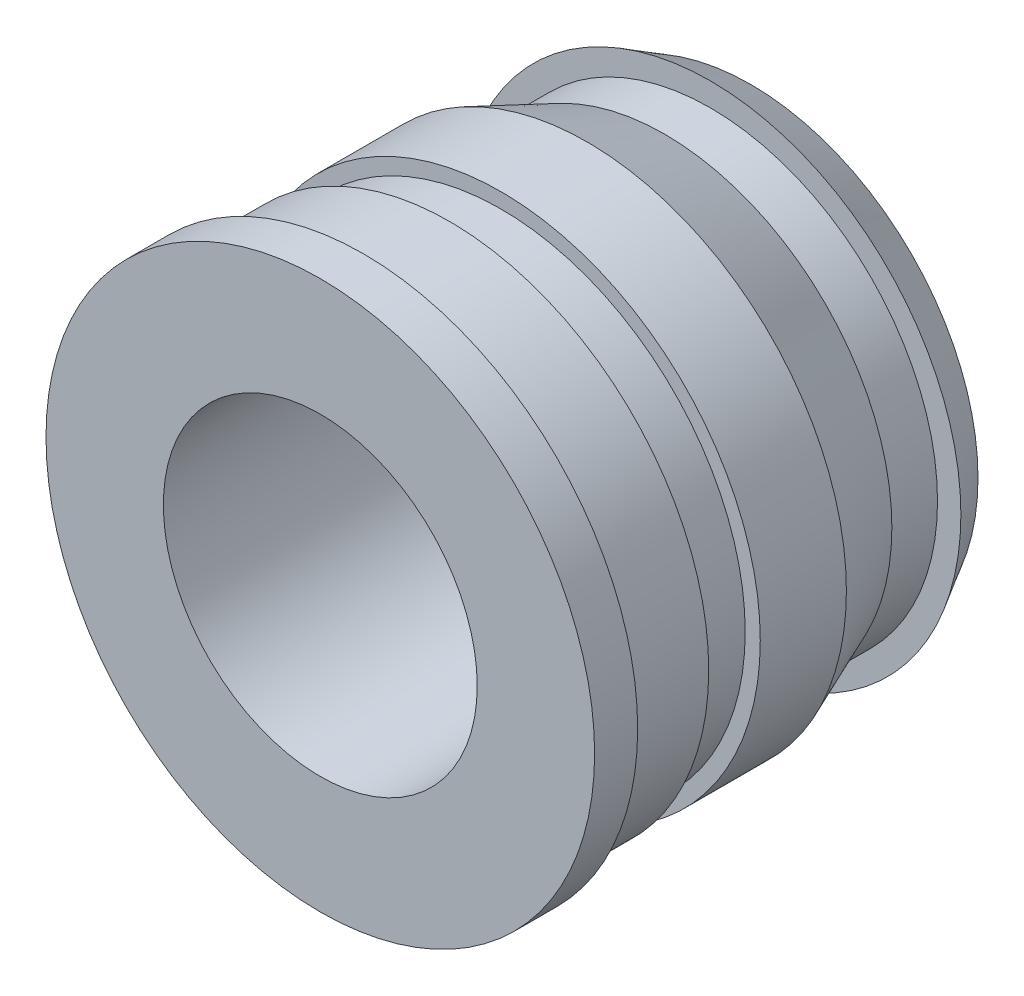
ISO-10303-21;
HEADER;
FILE_DESCRIPTION(('STEP AP214'),'2;1');
FILE_NAME('part.step','',(''),(''),'','','');
FILE_SCHEMA(('AUTOMOTIVE_DESIGN { 1 0 10303 214 1 1 1 1 }'));
ENDSEC;
DATA;
#1=APPLICATION_CONTEXT('core data for automotive mechanical design processes');
#2=APPLICATION_PROTOCOL_DEFINITION('international standard','automotive_design',2000,#1);
#3=PRODUCT_CONTEXT('',#1,'mechanical');
#4=PRODUCT('Part','Part','',(#3));
#5=PRODUCT_RELATED_PRODUCT_CATEGORY('part','',(#4));
#6=PRODUCT_DEFINITION_FORMATION('','',#4);
#7=PRODUCT_DEFINITION_CONTEXT('part definition',#1,'design');
#8=PRODUCT_DEFINITION('design','',#6,#7);
#9=PRODUCT_DEFINITION_SHAPE('','',#8);
#10=(LENGTH_UNIT() NAMED_UNIT(*) SI_UNIT(.MILLI.,.METRE.));
#11=(NAMED_UNIT(*) PLANE_ANGLE_UNIT() SI_UNIT($,.RADIAN.));
#12=(NAMED_UNIT(*) SI_UNIT($,.STERADIAN.) SOLID_ANGLE_UNIT());
#13=UNCERTAINTY_MEASURE_WITH_UNIT(LENGTH_MEASURE(1.E-05),#10,'distance_accuracy_value','');
#14=(GEOMETRIC_REPRESENTATION_CONTEXT(3) GLOBAL_UNCERTAINTY_ASSIGNED_CONTEXT((#13)) GLOBAL_UNIT_ASSIGNED_CONTEXT((#10,
#11,#12)) REPRESENTATION_CONTEXT('',''));
#15=CARTESIAN_POINT('',(0.,0.,0.));
#16=DIRECTION('',(0.,0.,1.));
#17=DIRECTION('',(1.,0.,0.));
#18=AXIS2_PLACEMENT_3D('',#15,#16,#17);
#19=CARTESIAN_POINT('',(0.,0.,1.715));
#20=DIRECTION('',(0.,0.,1.));
#21=DIRECTION('',(1.,0.,0.));
#22=AXIS2_PLACEMENT_3D('',#19,#20,#21);
#23=CYLINDRICAL_SURFACE('',#22,1.25);
#24=CARTESIAN_POINT('',(0.,0.,-1.715));
#25=DIRECTION('',(0.,0.,1.));
#26=DIRECTION('',(1.,0.,0.));
#27=AXIS2_PLACEMENT_3D('',#24,#25,#26);
#28=CIRCLE('',#27,1.25);
#29=CARTESIAN_POINT('',(1.25,0.,-1.715));
#30=VERTEX_POINT('',#29);
#31=EDGE_CURVE('E77',#30,#30,#28,.T.);
#32=ORIENTED_EDGE('',*,*,#31,.F.);
#33=EDGE_LOOP('',(#32));
#34=FACE_BOUND('',#33,.T.);
#35=CARTESIAN_POINT('',(0.,0.,1.715));
#36=DIRECTION('',(0.,0.,1.));
#37=DIRECTION('',(1.,0.,0.));
#38=AXIS2_PLACEMENT_3D('',#35,#36,#37);
#39=CIRCLE('',#38,1.25);
#40=CARTESIAN_POINT('',(1.25,0.,1.715));
#41=VERTEX_POINT('',#40);
#42=EDGE_CURVE('E10',#41,#41,#39,.T.);
#43=ORIENTED_EDGE('',*,*,#42,.T.);
#44=EDGE_LOOP('',(#43));
#45=FACE_BOUND('',#44,.T.);
#46=ADVANCED_FACE('F31',(#34,#45),#23,.F.);
#47=CARTESIAN_POINT('',(0.,1.25,1.715));
#48=DIRECTION('',(0.,0.,-1.));
#49=DIRECTION('',(-1.,0.,0.));
#50=AXIS2_PLACEMENT_3D('',#47,#48,#49);
#51=PLANE('',#50);
#52=ORIENTED_EDGE('',*,*,#42,.F.);
#53=EDGE_LOOP('',(#52));
#54=FACE_BOUND('',#53,.T.);
#55=CARTESIAN_POINT('',(0.,0.,1.715));
#56=DIRECTION('',(0.,0.,1.));
#57=DIRECTION('',(1.,0.,0.));
#58=AXIS2_PLACEMENT_3D('',#55,#56,#57);
#59=CIRCLE('',#58,2.185);
#60=CARTESIAN_POINT('',(2.185,0.,1.715));
#61=VERTEX_POINT('',#60);
#62=EDGE_CURVE('E37',#61,#61,#59,.T.);
#63=ORIENTED_EDGE('',*,*,#62,.T.);
#64=EDGE_LOOP('',(#63));
#65=FACE_BOUND('',#64,.T.);
#66=ADVANCED_FACE('F84',(#54,#65),#51,.F.);
#67=CARTESIAN_POINT('',(0.,0.,1.715));
#68=DIRECTION('',(0.,0.,1.));
#69=DIRECTION('',(1.,0.,0.));
#70=AXIS2_PLACEMENT_3D('',#67,#68,#69);
#71=CYLINDRICAL_SURFACE('',#70,2.185);
#72=ORIENTED_EDGE('',*,*,#62,.F.);
#73=EDGE_LOOP('',(#72));
#74=FACE_BOUND('',#73,.T.);
#75=CARTESIAN_POINT('',(0.,0.,1.372));
#76=DIRECTION('',(0.,0.,1.));
#77=DIRECTION('',(1.,0.,0.));
#78=AXIS2_PLACEMENT_3D('',#75,#76,#77);
#79=CIRCLE('',#78,2.185);
#80=CARTESIAN_POINT('',(2.185,0.,1.372));
#81=VERTEX_POINT('',#80);
#82=EDGE_CURVE('E41',#81,#81,#79,.T.);
#83=ORIENTED_EDGE('',*,*,#82,.T.);
#84=EDGE_LOOP('',(#83));
#85=FACE_BOUND('',#84,.T.);
#86=ADVANCED_FACE('F88',(#74,#85),#71,.T.);
#87=CARTESIAN_POINT('',(0.,2.185,1.372));
#88=DIRECTION('',(0.,0.,1.));
#89=DIRECTION('',(1.,0.,0.));
#90=AXIS2_PLACEMENT_3D('',#87,#88,#89);
#91=PLANE('',#90);
#92=ORIENTED_EDGE('',*,*,#82,.F.);
#93=EDGE_LOOP('',(#92));
#94=FACE_BOUND('',#93,.T.);
#95=CARTESIAN_POINT('',(0.,0.,1.372));
#96=DIRECTION('',(0.,0.,1.));
#97=DIRECTION('',(1.,0.,0.));
#98=AXIS2_PLACEMENT_3D('',#95,#96,#97);
#99=CIRCLE('',#98,2.065);
#100=CARTESIAN_POINT('',(2.065,0.,1.372));
#101=VERTEX_POINT('',#100);
#102=EDGE_CURVE('E45',#101,#101,#99,.T.);
#103=ORIENTED_EDGE('',*,*,#102,.T.);
#104=EDGE_LOOP('',(#103));
#105=FACE_BOUND('',#104,.T.);
#106=ADVANCED_FACE('F93',(#94,#105),#91,.F.);
#107=CARTESIAN_POINT('',(0.,0.,1.715));
#108=DIRECTION('',(0.,0.,1.));
#109=DIRECTION('',(1.,0.,0.));
#110=AXIS2_PLACEMENT_3D('',#107,#108,#109);
#111=CYLINDRICAL_SURFACE('',#110,2.065);
#112=ORIENTED_EDGE('',*,*,#102,.F.);
#113=EDGE_LOOP('',(#112));
#114=FACE_BOUND('',#113,.T.);
#115=CARTESIAN_POINT('',(0.,0.,0.686));
#116=DIRECTION('',(0.,0.,1.));
#117=DIRECTION('',(1.,0.,0.));
#118=AXIS2_PLACEMENT_3D('',#115,#116,#117);
#119=CIRCLE('',#118,2.065);
#120=CARTESIAN_POINT('',(2.065,0.,0.686));
#121=VERTEX_POINT('',#120);
#122=EDGE_CURVE('E50',#121,#121,#119,.T.);
#123=ORIENTED_EDGE('',*,*,#122,.T.);
#124=EDGE_LOOP('',(#123));
#125=FACE_BOUND('',#124,.T.);
#126=ADVANCED_FACE('F99',(#114,#125),#111,.T.);
#127=CARTESIAN_POINT('',(0.,2.065,0.686));
#128=DIRECTION('',(0.,0.,1.));
#129=DIRECTION('',(1.,0.,0.));
#130=AXIS2_PLACEMENT_3D('',#127,#128,#129);
#131=PLANE('',#130);
#132=ORIENTED_EDGE('',*,*,#122,.F.);
#133=EDGE_LOOP('',(#132));
#134=FACE_BOUND('',#133,.T.);
#135=CARTESIAN_POINT('',(0.,0.,0.686));
#136=DIRECTION('',(0.,0.,1.));
#137=DIRECTION('',(1.,0.,0.));
#138=AXIS2_PLACEMENT_3D('',#135,#136,#137);
#139=CIRCLE('',#138,1.945);
#140=CARTESIAN_POINT('',(1.945,0.,0.686));
#141=VERTEX_POINT('',#140);
#142=EDGE_CURVE('E53',#141,#141,#139,.T.);
#143=ORIENTED_EDGE('',*,*,#142,.T.);
#144=EDGE_LOOP('',(#143));
#145=FACE_BOUND('',#144,.T.);
#146=ADVANCED_FACE('F103',(#134,#145),#131,.F.);
#147=CARTESIAN_POINT('',(0.,0.,1.715));
#148=DIRECTION('',(0.,0.,1.));
#149=DIRECTION('',(1.,0.,0.));
#150=AXIS2_PLACEMENT_3D('',#147,#148,#149);
#151=CYLINDRICAL_SURFACE('',#150,1.945);
#152=ORIENTED_EDGE('',*,*,#142,.F.);
#153=EDGE_LOOP('',(#152));
#154=FACE_BOUND('',#153,.T.);
#155=CARTESIAN_POINT('',(0.,0.,0.275400804001867));
#156=DIRECTION('',(0.,0.,1.));
#157=DIRECTION('',(1.,0.,0.));
#158=AXIS2_PLACEMENT_3D('',#155,#156,#157);
#159=CIRCLE('',#158,1.945);
#160=CARTESIAN_POINT('',(1.945,0.,0.275400804001867));
#161=VERTEX_POINT('',#160);
#162=EDGE_CURVE('E56',#161,#161,#159,.T.);
#163=ORIENTED_EDGE('',*,*,#162,.T.);
#164=EDGE_LOOP('',(#163));
#165=FACE_BOUND('',#164,.T.);
#166=ADVANCED_FACE('F107',(#154,#165),#151,.T.);
#167=CARTESIAN_POINT('',(0.,1.945,0.275400804001867));
#168=DIRECTION('',(0.,0.,-1.));
#169=DIRECTION('',(-1.,0.,0.));
#170=AXIS2_PLACEMENT_3D('',#167,#168,#169);
#171=PLANE('',#170);
#172=ORIENTED_EDGE('',*,*,#162,.F.);
#173=EDGE_LOOP('',(#172));
#174=FACE_BOUND('',#173,.T.);
#175=CARTESIAN_POINT('',(0.,0.,0.275400804001867));
#176=DIRECTION('',(0.,0.,1.));
#177=DIRECTION('',(1.,0.,0.));
#178=AXIS2_PLACEMENT_3D('',#175,#176,#177);
#179=CIRCLE('',#178,2.065);
#180=CARTESIAN_POINT('',(2.065,0.,0.275400804001867));
#181=VERTEX_POINT('',#180);
#182=EDGE_CURVE('E59',#181,#181,#179,.T.);
#183=ORIENTED_EDGE('',*,*,#182,.T.);
#184=EDGE_LOOP('',(#183));
#185=FACE_BOUND('',#184,.T.);
#186=ADVANCED_FACE('F111',(#174,#185),#171,.F.);
#187=CARTESIAN_POINT('',(0.,0.,1.715));
#188=DIRECTION('',(0.,0.,1.));
#189=DIRECTION('',(1.,0.,0.));
#190=AXIS2_PLACEMENT_3D('',#187,#188,#189);
#191=CYLINDRICAL_SURFACE('',#190,2.065);
#192=ORIENTED_EDGE('',*,*,#182,.F.);
#193=EDGE_LOOP('',(#192));
#194=FACE_BOUND('',#193,.T.);
#195=CARTESIAN_POINT('',(0.,0.,-0.410599195998133));
#196=DIRECTION('',(0.,0.,1.));
#197=DIRECTION('',(1.,0.,0.));
#198=AXIS2_PLACEMENT_3D('',#195,#196,#197);
#199=CIRCLE('',#198,2.065);
#200=CARTESIAN_POINT('',(2.065,0.,-0.410599195998133));
#201=VERTEX_POINT('',#200);
#202=EDGE_CURVE('E62',#201,#201,#199,.T.);
#203=ORIENTED_EDGE('',*,*,#202,.T.);
#204=EDGE_LOOP('',(#203));
#205=FACE_BOUND('',#204,.T.);
#206=ADVANCED_FACE('F115',(#194,#205),#191,.T.);
#207=CARTESIAN_POINT('',(0.,0.,-1.029));
#208=DIRECTION('',(0.,0.,1.));
#209=DIRECTION('',(1.,0.,0.));
#210=AXIS2_PLACEMENT_3D('',#207,#208,#209);
#211=CONICAL_SURFACE('',#210,1.80885,0.392699081698725);
#212=ORIENTED_EDGE('',*,*,#202,.F.);
#213=EDGE_LOOP('',(#212));
#214=FACE_BOUND('',#213,.T.);
#215=CARTESIAN_POINT('',(0.,0.,-1.029));
#216=DIRECTION('',(0.,0.,1.));
#217=DIRECTION('',(1.,0.,0.));
#218=AXIS2_PLACEMENT_3D('',#215,#216,#217);
#219=CIRCLE('',#218,1.80885);
#220=CARTESIAN_POINT('',(1.80885,0.,-1.029));
#221=VERTEX_POINT('',#220);
#222=EDGE_CURVE('E65',#221,#221,#219,.T.);
#223=ORIENTED_EDGE('',*,*,#222,.T.);
#224=EDGE_LOOP('',(#223));
#225=FACE_BOUND('',#224,.T.);
#226=ADVANCED_FACE('F119',(#214,#225),#211,.T.);
#227=CARTESIAN_POINT('',(0.,0.,1.715));
#228=DIRECTION('',(0.,0.,1.));
#229=DIRECTION('',(1.,0.,0.));
#230=AXIS2_PLACEMENT_3D('',#227,#228,#229);
#231=CYLINDRICAL_SURFACE('',#230,1.80885);
#232=ORIENTED_EDGE('',*,*,#222,.F.);
#233=EDGE_LOOP('',(#232));
#234=FACE_BOUND('',#233,.T.);
#235=CARTESIAN_POINT('',(0.,0.,-1.39257874217105));
#236=DIRECTION('',(0.,0.,1.));
#237=DIRECTION('',(1.,0.,0.));
#238=AXIS2_PLACEMENT_3D('',#235,#236,#237);
#239=CIRCLE('',#238,1.80885);
#240=CARTESIAN_POINT('',(1.80885,0.,-1.39257874217105));
#241=VERTEX_POINT('',#240);
#242=EDGE_CURVE('E68',#241,#241,#239,.T.);
#243=ORIENTED_EDGE('',*,*,#242,.T.);
#244=EDGE_LOOP('',(#243));
#245=FACE_BOUND('',#244,.T.);
#246=ADVANCED_FACE('F123',(#234,#245),#231,.T.);
#247=CARTESIAN_POINT('',(0.,1.80885,-1.39257874217105));
#248=DIRECTION('',(0.,0.,-1.));
#249=DIRECTION('',(-1.,0.,0.));
#250=AXIS2_PLACEMENT_3D('',#247,#248,#249);
#251=PLANE('',#250);
#252=ORIENTED_EDGE('',*,*,#242,.F.);
#253=EDGE_LOOP('',(#252));
#254=FACE_BOUND('',#253,.T.);
#255=CARTESIAN_POINT('',(0.,0.,-1.39257874217105));
#256=DIRECTION('',(0.,0.,1.));
#257=DIRECTION('',(1.,0.,0.));
#258=AXIS2_PLACEMENT_3D('',#255,#256,#257);
#259=CIRCLE('',#258,1.995);
#260=CARTESIAN_POINT('',(1.995,0.,-1.39257874217105));
#261=VERTEX_POINT('',#260);
#262=EDGE_CURVE('E71',#261,#261,#259,.T.);
#263=ORIENTED_EDGE('',*,*,#262,.T.);
#264=EDGE_LOOP('',(#263));
#265=FACE_BOUND('',#264,.T.);
#266=ADVANCED_FACE('F127',(#254,#265),#251,.F.);
#267=CARTESIAN_POINT('',(0.,0.,-1.715));
#268=DIRECTION('',(0.,0.,1.));
#269=DIRECTION('',(1.,0.,0.));
#270=AXIS2_PLACEMENT_3D('',#267,#268,#269);
#271=CONICAL_SURFACE('',#270,1.80885,0.5235987755983);
#272=ORIENTED_EDGE('',*,*,#262,.F.);
#273=EDGE_LOOP('',(#272));
#274=FACE_BOUND('',#273,.T.);
#275=CARTESIAN_POINT('',(0.,0.,-1.715));
#276=DIRECTION('',(0.,0.,1.));
#277=DIRECTION('',(1.,0.,0.));
#278=AXIS2_PLACEMENT_3D('',#275,#276,#277);
#279=CIRCLE('',#278,1.80885);
#280=CARTESIAN_POINT('',(1.80885,0.,-1.715));
#281=VERTEX_POINT('',#280);
#282=EDGE_CURVE('E74',#281,#281,#279,.T.);
#283=ORIENTED_EDGE('',*,*,#282,.T.);
#284=EDGE_LOOP('',(#283));
#285=FACE_BOUND('',#284,.T.);
#286=ADVANCED_FACE('F131',(#274,#285),#271,.T.);
#287=CARTESIAN_POINT('',(0.,1.80885,-1.715));
#288=DIRECTION('',(0.,0.,1.));
#289=DIRECTION('',(1.,0.,0.));
#290=AXIS2_PLACEMENT_3D('',#287,#288,#289);
#291=PLANE('',#290);
#292=ORIENTED_EDGE('',*,*,#282,.F.);
#293=EDGE_LOOP('',(#292));
#294=FACE_BOUND('',#293,.T.);
#295=ORIENTED_EDGE('',*,*,#31,.T.);
#296=EDGE_LOOP('',(#295));
#297=FACE_BOUND('',#296,.T.);
#298=ADVANCED_FACE('F81',(#294,#297),#291,.F.);
#299=CLOSED_SHELL('',(#46,#66,#86,#106,#126,#146,#166,#186,#206,#226,#246,#266,#286,#298));
#300=MANIFOLD_SOLID_BREP('B2',#299);
#301=ADVANCED_BREP_SHAPE_REPRESENTATION('',(#18,#300),#14);
#302=SHAPE_DEFINITION_REPRESENTATION(#9,#301);
ENDSEC;
END-ISO-10303-21;
